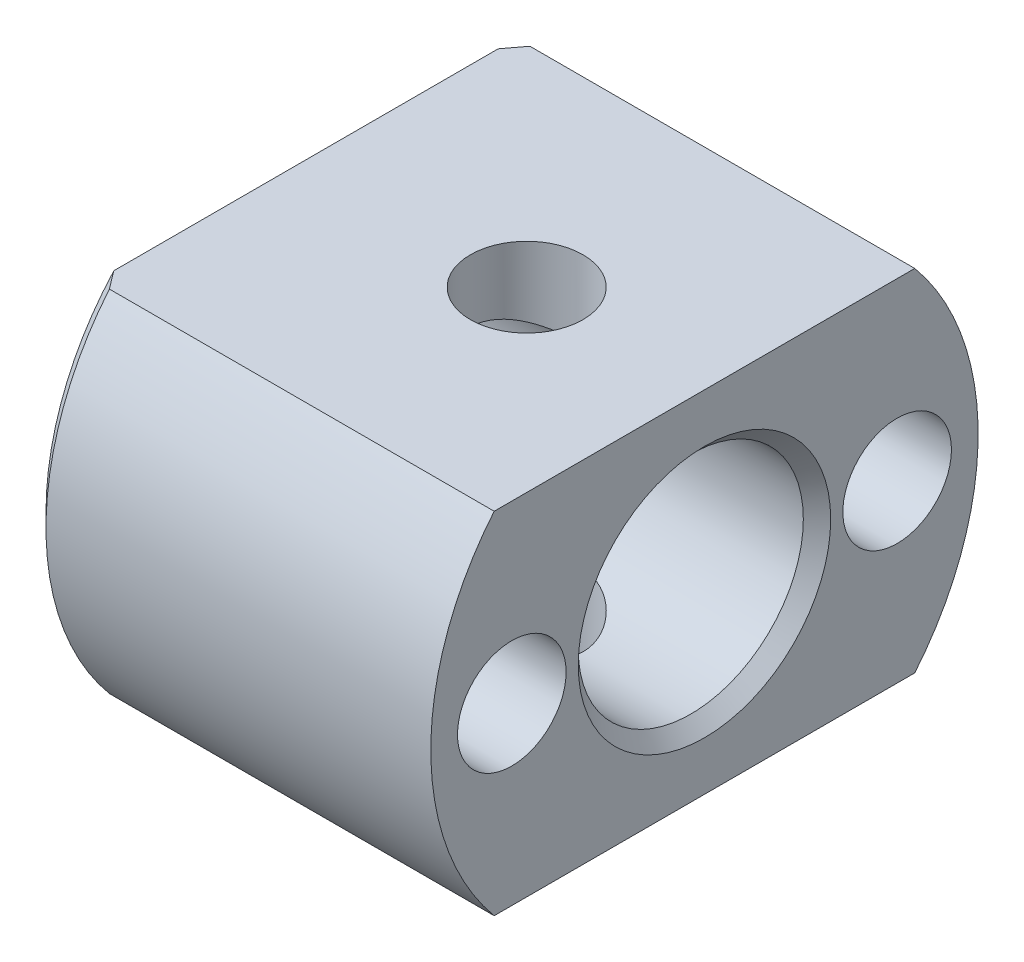
ISO-10303-21;
HEADER;
FILE_DESCRIPTION(('STEP AP214'),'2;1');
FILE_NAME('part.step','',(''),(''),'','','');
FILE_SCHEMA(('AUTOMOTIVE_DESIGN { 1 0 10303 214 1 1 1 1 }'));
ENDSEC;
DATA;
#1=APPLICATION_CONTEXT('core data for automotive mechanical design processes');
#2=APPLICATION_PROTOCOL_DEFINITION('international standard','automotive_design',2000,#1);
#3=PRODUCT_CONTEXT('',#1,'mechanical');
#4=PRODUCT('Part','Part','',(#3));
#5=PRODUCT_RELATED_PRODUCT_CATEGORY('part','',(#4));
#6=PRODUCT_DEFINITION_FORMATION('','',#4);
#7=PRODUCT_DEFINITION_CONTEXT('part definition',#1,'design');
#8=PRODUCT_DEFINITION('design','',#6,#7);
#9=PRODUCT_DEFINITION_SHAPE('','',#8);
#10=(LENGTH_UNIT() NAMED_UNIT(*) SI_UNIT(.MILLI.,.METRE.));
#11=(NAMED_UNIT(*) PLANE_ANGLE_UNIT() SI_UNIT($,.RADIAN.));
#12=(NAMED_UNIT(*) SI_UNIT($,.STERADIAN.) SOLID_ANGLE_UNIT());
#13=UNCERTAINTY_MEASURE_WITH_UNIT(LENGTH_MEASURE(1.E-05),#10,'distance_accuracy_value','');
#14=(GEOMETRIC_REPRESENTATION_CONTEXT(3) GLOBAL_UNCERTAINTY_ASSIGNED_CONTEXT((#13)) GLOBAL_UNIT_ASSIGNED_CONTEXT((#10,
#11,#12)) REPRESENTATION_CONTEXT('',''));
#15=CARTESIAN_POINT('',(0.,0.,0.));
#16=DIRECTION('',(0.,0.,1.));
#17=DIRECTION('',(1.,0.,0.));
#18=AXIS2_PLACEMENT_3D('',#15,#16,#17);
#19=CARTESIAN_POINT('',(2.032,0.,0.));
#20=DIRECTION('',(-1.,0.,0.));
#21=DIRECTION('',(0.,0.,1.));
#22=AXIS2_PLACEMENT_3D('',#19,#20,#21);
#23=CYLINDRICAL_SURFACE('',#22,7.9375);
#24=DIRECTION('',(-1.,0.,0.));
#25=VECTOR('',#24,1.);
#26=CARTESIAN_POINT('',(2.032,-5.08,6.09897583615479));
#27=LINE('',#26,#25);
#28=CARTESIAN_POINT('',(2.032,-5.08,6.09897583615479));
#29=VERTEX_POINT('',#28);
#30=CARTESIAN_POINT('',(-9.128125,-5.08,6.09897583615479));
#31=VERTEX_POINT('',#30);
#32=EDGE_CURVE('E66',#29,#31,#27,.T.);
#33=ORIENTED_EDGE('',*,*,#32,.F.);
#34=CARTESIAN_POINT('',(2.032,0.,0.));
#35=DIRECTION('',(1.,0.,0.));
#36=DIRECTION('',(0.,0.,-1.));
#37=AXIS2_PLACEMENT_3D('',#34,#35,#36);
#38=CIRCLE('',#37,7.9375);
#39=CARTESIAN_POINT('',(2.032,5.08,6.09897583615479));
#40=VERTEX_POINT('',#39);
#41=EDGE_CURVE('E117',#40,#29,#38,.T.);
#42=ORIENTED_EDGE('',*,*,#41,.F.);
#43=DIRECTION('',(-1.,0.,0.));
#44=VECTOR('',#43,1.);
#45=CARTESIAN_POINT('',(2.032,5.08,6.09897583615479));
#46=LINE('',#45,#44);
#47=CARTESIAN_POINT('',(-9.128125,5.08,6.09897583615479));
#48=VERTEX_POINT('',#47);
#49=EDGE_CURVE('E105',#40,#48,#46,.T.);
#50=ORIENTED_EDGE('',*,*,#49,.T.);
#51=CARTESIAN_POINT('',(-9.128125,0.,0.));
#52=DIRECTION('',(1.,0.,0.));
#53=DIRECTION('',(0.,0.,-1.));
#54=AXIS2_PLACEMENT_3D('',#51,#52,#53);
#55=CIRCLE('',#54,7.9375);
#56=EDGE_CURVE('E112',#48,#31,#55,.T.);
#57=ORIENTED_EDGE('',*,*,#56,.T.);
#58=EDGE_LOOP('',(#33,#42,#50,#57));
#59=FACE_BOUND('',#58,.T.);
#60=ADVANCED_FACE('F44',(#59),#23,.T.);
#61=DIRECTION('',(-1.,0.,0.));
#62=VECTOR('',#61,1.);
#63=CARTESIAN_POINT('',(2.032,-5.08,-6.09897583615479));
#64=LINE('',#63,#62);
#65=CARTESIAN_POINT('',(-9.128125,-5.08,-6.09897583615479));
#66=VERTEX_POINT('',#65);
#67=CARTESIAN_POINT('',(2.032,-5.08,-6.09897583615479));
#68=VERTEX_POINT('',#67);
#69=EDGE_CURVE('E251',#66,#68,#64,.F.);
#70=ORIENTED_EDGE('',*,*,#69,.F.);
#71=CARTESIAN_POINT('',(-9.128125,5.08,-6.09897583615479));
#72=VERTEX_POINT('',#71);
#73=EDGE_CURVE('E121',#66,#72,#55,.T.);
#74=ORIENTED_EDGE('',*,*,#73,.T.);
#75=DIRECTION('',(-1.,0.,0.));
#76=VECTOR('',#75,1.);
#77=CARTESIAN_POINT('',(2.032,5.08,-6.09897583615479));
#78=LINE('',#77,#76);
#79=CARTESIAN_POINT('',(2.032,5.08,-6.09897583615479));
#80=VERTEX_POINT('',#79);
#81=EDGE_CURVE('E247',#72,#80,#78,.F.);
#82=ORIENTED_EDGE('',*,*,#81,.T.);
#83=EDGE_CURVE('E219',#68,#80,#38,.T.);
#84=ORIENTED_EDGE('',*,*,#83,.F.);
#85=EDGE_LOOP('',(#70,#74,#82,#84));
#86=FACE_BOUND('',#85,.T.);
#87=ADVANCED_FACE('F192',(#86),#23,.T.);
#88=CARTESIAN_POINT('',(2.032,0.,0.));
#89=DIRECTION('',(1.,0.,0.));
#90=DIRECTION('',(0.,0.,-1.));
#91=AXIS2_PLACEMENT_3D('',#88,#89,#90);
#92=PLANE('',#91);
#93=CARTESIAN_POINT('',(2.032,0.,0.));
#94=DIRECTION('',(1.,0.,0.));
#95=DIRECTION('',(0.,0.,-1.));
#96=AXIS2_PLACEMENT_3D('',#93,#94,#95);
#97=CIRCLE('',#96,3.660775);
#98=CARTESIAN_POINT('',(2.032,0.,-3.660775));
#99=VERTEX_POINT('',#98);
#100=EDGE_CURVE('E124',#99,#99,#97,.F.);
#101=ORIENTED_EDGE('',*,*,#100,.T.);
#102=EDGE_LOOP('',(#101));
#103=FACE_BOUND('',#102,.T.);
#104=CARTESIAN_POINT('',(2.032,0.,-5.588));
#105=DIRECTION('',(1.,0.,0.));
#106=DIRECTION('',(0.,0.,-1.));
#107=AXIS2_PLACEMENT_3D('',#104,#105,#106);
#108=CIRCLE('',#107,1.575);
#109=CARTESIAN_POINT('',(2.032,0.,-7.163));
#110=VERTEX_POINT('',#109);
#111=EDGE_CURVE('E209',#110,#110,#108,.F.);
#112=ORIENTED_EDGE('',*,*,#111,.T.);
#113=EDGE_LOOP('',(#112));
#114=FACE_BOUND('',#113,.T.);
#115=CARTESIAN_POINT('',(2.032,0.,5.588));
#116=DIRECTION('',(1.,0.,0.));
#117=DIRECTION('',(0.,0.,-1.));
#118=AXIS2_PLACEMENT_3D('',#115,#116,#117);
#119=CIRCLE('',#118,1.575);
#120=CARTESIAN_POINT('',(2.032,0.,4.013));
#121=VERTEX_POINT('',#120);
#122=EDGE_CURVE('E213',#121,#121,#119,.T.);
#123=ORIENTED_EDGE('',*,*,#122,.F.);
#124=EDGE_LOOP('',(#123));
#125=FACE_BOUND('',#124,.T.);
#126=ORIENTED_EDGE('',*,*,#41,.T.);
#127=DIRECTION('',(0.,0.,-1.));
#128=VECTOR('',#127,1.);
#129=CARTESIAN_POINT('',(2.032,-5.08,0.));
#130=LINE('',#129,#128);
#131=EDGE_CURVE('E216',#29,#68,#130,.T.);
#132=ORIENTED_EDGE('',*,*,#131,.T.);
#133=ORIENTED_EDGE('',*,*,#83,.T.);
#134=DIRECTION('',(0.,0.,-1.));
#135=VECTOR('',#134,1.);
#136=CARTESIAN_POINT('',(2.032,5.08,0.));
#137=LINE('',#136,#135);
#138=EDGE_CURVE('E118',#40,#80,#137,.T.);
#139=ORIENTED_EDGE('',*,*,#138,.F.);
#140=EDGE_LOOP('',(#126,#132,#133,#139));
#141=FACE_BOUND('',#140,.T.);
#142=ADVANCED_FACE('F196',(#103,#114,#125,#141),#92,.T.);
#143=CARTESIAN_POINT('',(-9.525,0.,0.));
#144=DIRECTION('',(1.,0.,0.));
#145=DIRECTION('',(0.,0.,-1.));
#146=AXIS2_PLACEMENT_3D('',#143,#144,#145);
#147=PLANE('',#146);
#148=CARTESIAN_POINT('',(-9.525,0.,5.588));
#149=DIRECTION('',(1.,0.,0.));
#150=DIRECTION('',(0.,0.,-1.));
#151=AXIS2_PLACEMENT_3D('',#148,#149,#150);
#152=CIRCLE('',#151,1.575);
#153=CARTESIAN_POINT('',(-9.525,0.,4.013));
#154=VERTEX_POINT('',#153);
#155=EDGE_CURVE('E373',#154,#154,#152,.T.);
#156=ORIENTED_EDGE('',*,*,#155,.T.);
#157=EDGE_LOOP('',(#156));
#158=FACE_BOUND('',#157,.T.);
#159=CARTESIAN_POINT('',(-9.525,0.,-5.588));
#160=DIRECTION('',(1.,0.,0.));
#161=DIRECTION('',(0.,0.,-1.));
#162=AXIS2_PLACEMENT_3D('',#159,#160,#161);
#163=CIRCLE('',#162,1.575);
#164=CARTESIAN_POINT('',(-9.525,0.,-7.163));
#165=VERTEX_POINT('',#164);
#166=EDGE_CURVE('E374',#165,#165,#163,.F.);
#167=ORIENTED_EDGE('',*,*,#166,.F.);
#168=EDGE_LOOP('',(#167));
#169=FACE_BOUND('',#168,.T.);
#170=CARTESIAN_POINT('',(-9.525,0.,0.));
#171=DIRECTION('',(1.,0.,0.));
#172=DIRECTION('',(0.,0.,-1.));
#173=AXIS2_PLACEMENT_3D('',#170,#171,#172);
#174=CIRCLE('',#173,3.660775);
#175=CARTESIAN_POINT('',(-9.525,0.,3.660775));
#176=VERTEX_POINT('',#175);
#177=EDGE_CURVE('E227',#176,#176,#174,.T.);
#178=ORIENTED_EDGE('',*,*,#177,.T.);
#179=EDGE_LOOP('',(#178));
#180=FACE_BOUND('',#179,.T.);
#181=DIRECTION('',(0.,0.,-1.));
#182=VECTOR('',#181,1.);
#183=CARTESIAN_POINT('',(-9.525,-5.08,0.));
#184=LINE('',#183,#182);
#185=CARTESIAN_POINT('',(-9.525,-5.08,5.57266770861364));
#186=VERTEX_POINT('',#185);
#187=CARTESIAN_POINT('',(-9.525,-5.08,-5.57266770861362));
#188=VERTEX_POINT('',#187);
#189=EDGE_CURVE('E241',#186,#188,#184,.T.);
#190=ORIENTED_EDGE('',*,*,#189,.F.);
#191=CARTESIAN_POINT('',(-9.525,0.,0.));
#192=DIRECTION('',(1.,0.,0.));
#193=DIRECTION('',(0.,0.,-1.));
#194=AXIS2_PLACEMENT_3D('',#191,#192,#193);
#195=CIRCLE('',#194,7.540625);
#196=CARTESIAN_POINT('',(-9.525,5.08,5.57266770861362));
#197=VERTEX_POINT('',#196);
#198=EDGE_CURVE('E222',#186,#197,#195,.F.);
#199=ORIENTED_EDGE('',*,*,#198,.T.);
#200=DIRECTION('',(0.,0.,-1.));
#201=VECTOR('',#200,1.);
#202=CARTESIAN_POINT('',(-9.525,5.08,0.));
#203=LINE('',#202,#201);
#204=CARTESIAN_POINT('',(-9.525,5.08,-5.57266770861362));
#205=VERTEX_POINT('',#204);
#206=EDGE_CURVE('E74',#197,#205,#203,.T.);
#207=ORIENTED_EDGE('',*,*,#206,.T.);
#208=EDGE_CURVE('E218',#205,#188,#195,.F.);
#209=ORIENTED_EDGE('',*,*,#208,.T.);
#210=EDGE_LOOP('',(#190,#199,#207,#209));
#211=FACE_BOUND('',#210,.T.);
#212=ADVANCED_FACE('F142',(#158,#169,#180,#211),#147,.F.);
#213=CARTESIAN_POINT('',(-3.1242,-7.9375,0.));
#214=DIRECTION('',(0.,1.,0.));
#215=DIRECTION('',(0.,0.,1.));
#216=AXIS2_PLACEMENT_3D('',#213,#214,#215);
#217=CYLINDRICAL_SURFACE('',#216,1.63195);
#218=CARTESIAN_POINT('',(-3.1242,-2.82662031541203,1.63195));
#219=CARTESIAN_POINT('',(-3.03916266241576,-2.82662772400109,1.63194406471948));
#220=CARTESIAN_POINT('',(-2.9540179504617,-2.83051611348359,1.62525895723807));
#221=CARTESIAN_POINT('',(-2.78634185541012,-2.84550663931427,1.59885929239313));
#222=CARTESIAN_POINT('',(-2.70381634644491,-2.8566239331897,1.57911735604919));
#223=CARTESIAN_POINT('',(-2.54412065637391,-2.8844609619268,1.52766831128066));
#224=CARTESIAN_POINT('',(-2.46692454489573,-2.90115086346174,1.49602480697214));
#225=CARTESIAN_POINT('',(-2.31895637355145,-2.93820626847871,1.42186503803797));
#226=CARTESIAN_POINT('',(-2.24818466149918,-2.95857197078864,1.37934818520968));
#227=CARTESIAN_POINT('',(-2.10862816628058,-3.00273690458291,1.28053656081937));
#228=CARTESIAN_POINT('',(-2.04048869353756,-3.02668078653958,1.22339464038483));
#229=CARTESIAN_POINT('',(-1.91425858053967,-3.07413657307132,1.09871655133643));
#230=CARTESIAN_POINT('',(-1.85617295272182,-3.09764825697908,1.03117522953041));
#231=CARTESIAN_POINT('',(-1.74786697768457,-3.14348619313365,0.882051943014368));
#232=CARTESIAN_POINT('',(-1.69844073354164,-3.16562570769136,0.799830427109071));
#233=CARTESIAN_POINT('',(-1.61441638454558,-3.20434616416626,0.62692505955906));
#234=CARTESIAN_POINT('',(-1.57980892173695,-3.22093061262307,0.536246592614562));
#235=CARTESIAN_POINT('',(-1.52896126798968,-3.24562968727533,0.355838446239998));
#236=CARTESIAN_POINT('',(-1.51158938046409,-3.25426301246485,0.266500356988225));
#237=CARTESIAN_POINT('',(-1.49197890262827,-3.26402376457589,0.085792637503453));
#238=CARTESIAN_POINT('',(-1.48973115568224,-3.26515573305111,-0.00557572990668942));
#239=CARTESIAN_POINT('',(-1.49999633458591,-3.26003198338551,-0.179241188233339));
#240=CARTESIAN_POINT('',(-1.51124265942986,-3.25441014371211,-0.261636180996565));
#241=CARTESIAN_POINT('',(-1.54590989321021,-3.23736849551645,-0.423187110082106));
#242=CARTESIAN_POINT('',(-1.56933171316475,-3.22594825313651,-0.502342803549232));
#243=CARTESIAN_POINT('',(-1.62783659373027,-3.19815825346288,-0.656548811571933));
#244=CARTESIAN_POINT('',(-1.66307650928116,-3.18172220353577,-0.731527174505596));
#245=CARTESIAN_POINT('',(-1.74400018207003,-3.14538201367974,-0.874687341229677));
#246=CARTESIAN_POINT('',(-1.78968767835627,-3.12547663273206,-0.942866699172228));
#247=CARTESIAN_POINT('',(-1.8951708689343,-3.08184609439822,-1.07737040590281));
#248=CARTESIAN_POINT('',(-1.95589193707663,-3.05793772660222,-1.14291019374417));
#249=CARTESIAN_POINT('',(-2.0872422015998,-3.01020261120647,-1.26329962710746));
#250=CARTESIAN_POINT('',(-2.15787894988266,-2.98637594013093,-1.31814104782857));
#251=CARTESIAN_POINT('',(-2.31254671762649,-2.9398625553513,-1.41898923086936));
#252=CARTESIAN_POINT('',(-2.39714346532332,-2.91734432008835,-1.46421379717843));
#253=CARTESIAN_POINT('',(-2.57413113277432,-2.87835916082122,-1.53944962646236));
#254=CARTESIAN_POINT('',(-2.66651380136301,-2.8618859273368,-1.56947676426726));
#255=CARTESIAN_POINT('',(-2.84875052168795,-2.83868948421609,-1.61102874538232));
#256=CARTESIAN_POINT('',(-2.93822480422312,-2.83129707761954,-1.6238312480437));
#257=CARTESIAN_POINT('',(-3.11832716928792,-2.82519788502179,-1.63442558102252));
#258=CARTESIAN_POINT('',(-3.20895439160204,-2.82648496364012,-1.63222801462026));
#259=CARTESIAN_POINT('',(-3.37821941242456,-2.83688945517407,-1.61405737093519));
#260=CARTESIAN_POINT('',(-3.45708426523558,-2.84513489831484,-1.59961750748391));
#261=CARTESIAN_POINT('',(-3.61112130880489,-2.86723858470711,-1.55964855170591));
#262=CARTESIAN_POINT('',(-3.68629229492593,-2.88109864554415,-1.53411586817481));
#263=CARTESIAN_POINT('',(-3.83476952146665,-2.91362187622896,-1.47144378222374));
#264=CARTESIAN_POINT('',(-3.90782814655415,-2.93247777190517,-1.43382158224334));
#265=CARTESIAN_POINT('',(-4.04701757768806,-2.97269679213537,-1.34845917412059));
#266=CARTESIAN_POINT('',(-4.1131447987315,-2.99406120212933,-1.30071376834996));
#267=CARTESIAN_POINT('',(-4.24531499966006,-3.04012699080817,-1.18942581501017));
#268=CARTESIAN_POINT('',(-4.31029661011369,-3.06490953378642,-1.12465062715441));
#269=CARTESIAN_POINT('',(-4.42880080179364,-3.11268734772172,-0.984725966265238));
#270=CARTESIAN_POINT('',(-4.48231951228773,-3.13568201329331,-0.909573002963794));
#271=CARTESIAN_POINT('',(-4.57757179206427,-3.17808165211557,-0.748306784927765));
#272=CARTESIAN_POINT('',(-4.6189570522643,-3.19737587026668,-0.661956614086075));
#273=CARTESIAN_POINT('',(-4.68620120220007,-3.22935741125831,-0.482277722976016));
#274=CARTESIAN_POINT('',(-4.71207372544724,-3.24205053422657,-0.388955211786963));
#275=CARTESIAN_POINT('',(-4.74532782830484,-3.25847389977424,-0.207224492579125));
#276=CARTESIAN_POINT('',(-4.75418819353602,-3.26291965349773,-0.119151025791754));
#277=CARTESIAN_POINT('',(-4.75752616705831,-3.26458754665695,0.0573238527730659));
#278=CARTESIAN_POINT('',(-4.75200881022903,-3.26181221481761,0.145725138926566));
#279=CARTESIAN_POINT('',(-4.72772729492988,-3.24976680445048,0.314212376561967));
#280=CARTESIAN_POINT('',(-4.70985998425394,-3.24093674453426,0.394462417052091));
#281=CARTESIAN_POINT('',(-4.66259520348752,-3.21807637254024,0.550694921666053));
#282=CARTESIAN_POINT('',(-4.63319607989349,-3.20404531472666,0.626676772003141));
#283=CARTESIAN_POINT('',(-4.56239338721774,-3.17130202684395,0.775867227821338));
#284=CARTESIAN_POINT('',(-4.52053016349097,-3.1524152483758,0.848818226629339));
#285=CARTESIAN_POINT('',(-4.42656475473457,-3.11193498880803,0.986961976708396));
#286=CARTESIAN_POINT('',(-4.37445786700068,-3.09034026618917,1.05215114249076));
#287=CARTESIAN_POINT('',(-4.2554724089719,-3.04405365459345,1.17975950908384));
#288=CARTESIAN_POINT('',(-4.1876398385616,-3.0192674149714,1.24125739128386));
#289=CARTESIAN_POINT('',(-4.04225229565227,-2.97117837143967,1.35233705186374));
#290=CARTESIAN_POINT('',(-3.96468881328498,-2.94787689321076,1.40190828807891));
#291=CARTESIAN_POINT('',(-3.79878832461221,-2.90486455877358,1.4890419006562));
#292=CARTESIAN_POINT('',(-3.71018831557446,-2.8852904437752,1.52617526839495));
#293=CARTESIAN_POINT('',(-3.5267491827377,-2.85372823820053,1.58442550997899));
#294=CARTESIAN_POINT('',(-3.43193209693894,-2.84171479852242,1.60559595143861));
#295=CARTESIAN_POINT('',(-3.30076824984373,-2.83191096422492,1.62275723848433));
#296=CARTESIAN_POINT('',(-3.26557926473737,-2.82993396129957,1.62619917949576));
#297=CARTESIAN_POINT('',(-3.19499973435061,-2.82728705072014,1.63079687243656));
#298=CARTESIAN_POINT('',(-3.15960917574507,-2.82661723050792,1.63195247142487));
#299=CARTESIAN_POINT('',(-3.1242,-2.82662031541203,1.63195));
#300=B_SPLINE_CURVE_WITH_KNOTS('',3,(#218,#219,#220,#221,#222,#223,#224,#225,#226,#227,#228,
#229,#230,#231,#232,#233,#234,#235,#236,#237,#238,#239,#240,#241,#242,#243,#244,#245,#246,#247,
#248,#249,#250,#251,#252,#253,#254,#255,#256,#257,#258,#259,#260,#261,#262,#263,#264,#265,#266,
#267,#268,#269,#270,#271,#272,#273,#274,#275,#276,#277,#278,#279,#280,#281,#282,#283,#284,#285,
#286,#287,#288,#289,#290,#291,#292,#293,#294,#295,#296,#297,#298,#299),.UNSPECIFIED.,.T.,.F.,(4,
2,2,2,2,2,2,2,2,2,2,2,2,2,2,2,2,2,2,2,2,2,2,2,2,2,2,2,2,2,2,2,2,2,2,2,2,2,2,2,4),(0.,
0.254963012468446,0.51046236144544,0.764615242109826,1.01878187429021,1.29391165088149,
1.56917820331139,1.8629997223905,2.15663542063722,2.42937764293422,2.70195472354433,
2.95082830289892,3.19972050662861,3.45205624204495,3.70448242674676,3.98076980098073,
4.25726875234927,4.55132645260373,4.84507635074792,5.11554785559531,5.38582818878765,
5.62654228638838,5.86733437123033,6.11927879369915,6.37135288836806,6.65520215186382,
6.93914711351177,7.23058590856889,7.52176819308925,7.78623369662123,8.05060660043422,
8.29755879169032,8.5445464054493,8.80209777136642,9.05976765232869,9.34308089187217,
9.62664364426149,9.91916751893551,10.2107053330385,10.3168637161567,10.4230292003247),.UNSPECIFIED.);
#301=CARTESIAN_POINT('',(-3.1242,-2.82662031541203,1.63195));
#302=VERTEX_POINT('',#301);
#303=EDGE_CURVE('E148',#302,#302,#300,.T.);
#304=ORIENTED_EDGE('',*,*,#303,.T.);
#305=EDGE_LOOP('',(#304));
#306=FACE_BOUND('',#305,.T.);
#307=CARTESIAN_POINT('',(-3.1242,-5.08,0.));
#308=DIRECTION('',(0.,-1.,0.));
#309=DIRECTION('',(0.,0.,-1.));
#310=AXIS2_PLACEMENT_3D('',#307,#308,#309);
#311=CIRCLE('',#310,1.63195);
#312=CARTESIAN_POINT('',(-3.1242,-5.08,-1.63195));
#313=VERTEX_POINT('',#312);
#314=EDGE_CURVE('E161',#313,#313,#311,.F.);
#315=ORIENTED_EDGE('',*,*,#314,.F.);
#316=EDGE_LOOP('',(#315));
#317=FACE_BOUND('',#316,.T.);
#318=ADVANCED_FACE('F138',(#306,#317),#217,.F.);
#319=CARTESIAN_POINT('',(-9.128125,0.,0.));
#320=DIRECTION('',(1.,0.,0.));
#321=DIRECTION('',(0.,0.,-1.));
#322=AXIS2_PLACEMENT_3D('',#319,#320,#321);
#323=CONICAL_SURFACE('',#322,7.9375,0.785398163397453);
#324=ORIENTED_EDGE('',*,*,#73,.F.);
#325=CARTESIAN_POINT('',(-9.127425,-5.08,-6.09988682190088));
#326=CARTESIAN_POINT('',(-9.24204980086968,-5.08,-5.95068288505701));
#327=CARTESIAN_POINT('',(-9.35563029055151,-5.08,-5.80066345163349));
#328=CARTESIAN_POINT('',(-9.58021873878119,-5.08,-5.49865558705955));
#329=CARTESIAN_POINT('',(-9.69122605360265,-5.08,-5.34666667772324));
#330=CARTESIAN_POINT('',(-9.91102337321846,-5.08,-5.03920151181867));
#331=CARTESIAN_POINT('',(-10.0197877729485,-5.08,-4.88370688885874));
#332=CARTESIAN_POINT('',(-10.2334328700727,-5.08,-4.57008065030622));
#333=CARTESIAN_POINT('',(-10.3383138418424,-5.08,-4.41194922216099));
#334=CARTESIAN_POINT('',(-10.5501156949655,-5.08,-4.0819757631368));
#335=CARTESIAN_POINT('',(-10.6567078608569,-5.08,-3.90992161807157));
#336=CARTESIAN_POINT('',(-10.8630244707936,-5.08,-3.56167646421194));
#337=CARTESIAN_POINT('',(-10.9627477022794,-5.08,-3.3854847323412));
#338=CARTESIAN_POINT('',(-11.1530847712256,-5.08,-3.02892549344396));
#339=CARTESIAN_POINT('',(-11.2437264778794,-5.08,-2.84857299073836));
#340=CARTESIAN_POINT('',(-11.4137359526367,-5.08,-2.48267463125855));
#341=CARTESIAN_POINT('',(-11.4931092723413,-5.08,-2.2971313861247));
#342=CARTESIAN_POINT('',(-11.6344309351293,-5.08,-1.92851490968909));
#343=CARTESIAN_POINT('',(-11.6969786842357,-5.08,-1.74567460858899));
#344=CARTESIAN_POINT('',(-11.8057728362921,-5.08,-1.37512336073294));
#345=CARTESIAN_POINT('',(-11.8520199390843,-5.08,-1.18741262345296));
#346=CARTESIAN_POINT('',(-11.9242991694479,-5.08,-0.812340539993367));
#347=CARTESIAN_POINT('',(-11.9507533231571,-5.08,-0.625062220165761));
#348=CARTESIAN_POINT('',(-11.9829919439029,-5.08,-0.248724249309546));
#349=CARTESIAN_POINT('',(-11.9887801689555,-5.08,-0.0596649284188974));
#350=CARTESIAN_POINT('',(-11.9791707513326,-5.08,0.31860265527366));
#351=CARTESIAN_POINT('',(-11.9636945273523,-5.08,0.507808874199122));
#352=CARTESIAN_POINT('',(-11.9127363904579,-5.08,0.883490676332864));
#353=CARTESIAN_POINT('',(-11.8772493053544,-5.08,1.06996554078069));
#354=CARTESIAN_POINT('',(-11.7878898945343,-5.08,1.44278064829043));
#355=CARTESIAN_POINT('',(-11.7336246472869,-5.08,1.62902486622444));
#356=CARTESIAN_POINT('',(-11.6101608257655,-5.08,1.99641178889479));
#357=CARTESIAN_POINT('',(-11.5409619938312,-5.08,2.17755440554839));
#358=CARTESIAN_POINT('',(-11.3920685004807,-5.08,2.53142943959996));
#359=CARTESIAN_POINT('',(-11.3125941487772,-5.08,2.70425576387929));
#360=CARTESIAN_POINT('',(-11.1445467754902,-5.08,3.04545924807842));
#361=CARTESIAN_POINT('',(-11.0559706308559,-5.08,3.21383485576485));
#362=CARTESIAN_POINT('',(-10.8714313700247,-5.08,3.54695696683724));
#363=CARTESIAN_POINT('',(-10.7754520111165,-5.08,3.71169440809592));
#364=CARTESIAN_POINT('',(-10.5777708310201,-5.08,4.03765253529767));
#365=CARTESIAN_POINT('',(-10.476069727764,-5.08,4.19887365894132));
#366=CARTESIAN_POINT('',(-10.2744209360305,-5.08,4.50854710136588));
#367=CARTESIAN_POINT('',(-10.1747458127731,-5.08,4.65717770409077));
#368=CARTESIAN_POINT('',(-9.97205611621789,-5.08,4.95215046453449));
#369=CARTESIAN_POINT('',(-9.86904136058242,-5.08,5.09849249665288));
#370=CARTESIAN_POINT('',(-9.66087505647831,-5.08,5.38832506358979));
#371=CARTESIAN_POINT('',(-9.55573986870922,-5.08,5.53182738387818));
#372=CARTESIAN_POINT('',(-9.34319020662555,-5.08,5.81709196274639));
#373=CARTESIAN_POINT('',(-9.23577618241421,-5.08,5.95885455637512));
#374=CARTESIAN_POINT('',(-9.127425,-5.08,6.09988682190088));
#375=B_SPLINE_CURVE_WITH_KNOTS('',3,(#325,#326,#327,#328,#329,#330,#331,#332,#333,#334,#335,
#336,#337,#338,#339,#340,#341,#342,#343,#344,#345,#346,#347,#348,#349,#350,#351,#352,#353,#354,
#355,#356,#357,#358,#359,#360,#361,#362,#363,#364,#365,#366,#367,#368,#369,#370,#371,#372,#373,
#374),.UNSPECIFIED.,.F.,.F.,(4,2,2,2,2,2,2,2,2,2,2,2,2,2,2,2,2,2,2,2,2,2,2,2,4),(0.,
0.564462801719474,1.12906532245986,1.69829184793939,2.26747807884511,2.87454192699576,
3.48171266572311,4.08695906548077,4.69190623566581,5.27101760997042,5.85010411802446,
6.41646090638696,6.98271469979816,7.551066682499,8.1195656340076,8.70076167097238,
9.28196773655252,9.85231237608731,10.4228533726503,10.9946838381702,11.56644271297,
12.1032656589534,12.6401179639768,13.1737760293474,13.7073296531562),.UNSPECIFIED.);
#376=EDGE_CURVE('E11',#66,#188,#375,.T.);
#377=ORIENTED_EDGE('',*,*,#376,.T.);
#378=ORIENTED_EDGE('',*,*,#208,.F.);
#379=CARTESIAN_POINT('',(-9.127425,5.08,-6.09988682190088));
#380=CARTESIAN_POINT('',(-9.24204980086968,5.08,-5.95068288505701));
#381=CARTESIAN_POINT('',(-9.35563029055151,5.08,-5.80066345163349));
#382=CARTESIAN_POINT('',(-9.58021873878119,5.08,-5.49865558705955));
#383=CARTESIAN_POINT('',(-9.69122605360265,5.08,-5.34666667772324));
#384=CARTESIAN_POINT('',(-9.91102337321846,5.08,-5.03920151181867));
#385=CARTESIAN_POINT('',(-10.0197877729485,5.08,-4.88370688885874));
#386=CARTESIAN_POINT('',(-10.2334328700727,5.08,-4.57008065030622));
#387=CARTESIAN_POINT('',(-10.3383138418424,5.08,-4.41194922216099));
#388=CARTESIAN_POINT('',(-10.5501156949655,5.08,-4.0819757631368));
#389=CARTESIAN_POINT('',(-10.6567078608569,5.08,-3.90992161807157));
#390=CARTESIAN_POINT('',(-10.8630244707936,5.08,-3.56167646421194));
#391=CARTESIAN_POINT('',(-10.9627477022794,5.08,-3.3854847323412));
#392=CARTESIAN_POINT('',(-11.1530847712256,5.08,-3.02892549344396));
#393=CARTESIAN_POINT('',(-11.2437264778794,5.08,-2.84857299073836));
#394=CARTESIAN_POINT('',(-11.4137359526367,5.08,-2.48267463125855));
#395=CARTESIAN_POINT('',(-11.4931092723413,5.08,-2.2971313861247));
#396=CARTESIAN_POINT('',(-11.6344309351293,5.08,-1.92851490968909));
#397=CARTESIAN_POINT('',(-11.6969786842357,5.08,-1.74567460858899));
#398=CARTESIAN_POINT('',(-11.8057728362921,5.08,-1.37512336073294));
#399=CARTESIAN_POINT('',(-11.8520199390843,5.08,-1.18741262345296));
#400=CARTESIAN_POINT('',(-11.9242991694479,5.08,-0.812340539993367));
#401=CARTESIAN_POINT('',(-11.9507533231571,5.08,-0.625062220165761));
#402=CARTESIAN_POINT('',(-11.9829919439029,5.08,-0.248724249309546));
#403=CARTESIAN_POINT('',(-11.9887801689555,5.08,-0.0596649284188974));
#404=CARTESIAN_POINT('',(-11.9791707513326,5.08,0.31860265527366));
#405=CARTESIAN_POINT('',(-11.9636945273523,5.08,0.507808874199122));
#406=CARTESIAN_POINT('',(-11.9127363904579,5.08,0.883490676332864));
#407=CARTESIAN_POINT('',(-11.8772493053544,5.08,1.06996554078069));
#408=CARTESIAN_POINT('',(-11.7878898945343,5.08,1.44278064829043));
#409=CARTESIAN_POINT('',(-11.7336246472869,5.08,1.62902486622444));
#410=CARTESIAN_POINT('',(-11.6101608257655,5.08,1.99641178889479));
#411=CARTESIAN_POINT('',(-11.5409619938312,5.08,2.17755440554839));
#412=CARTESIAN_POINT('',(-11.3920685004807,5.08,2.53142943959996));
#413=CARTESIAN_POINT('',(-11.3125941487772,5.08,2.70425576387929));
#414=CARTESIAN_POINT('',(-11.1445467754902,5.08,3.04545924807842));
#415=CARTESIAN_POINT('',(-11.0559706308559,5.08,3.21383485576485));
#416=CARTESIAN_POINT('',(-10.8714313700247,5.08,3.54695696683724));
#417=CARTESIAN_POINT('',(-10.7754520111165,5.08,3.71169440809592));
#418=CARTESIAN_POINT('',(-10.5777708310201,5.08,4.03765253529767));
#419=CARTESIAN_POINT('',(-10.476069727764,5.08,4.19887365894132));
#420=CARTESIAN_POINT('',(-10.2744209360305,5.08,4.50854710136588));
#421=CARTESIAN_POINT('',(-10.1747458127731,5.08,4.65717770409077));
#422=CARTESIAN_POINT('',(-9.97205611621789,5.08,4.95215046453449));
#423=CARTESIAN_POINT('',(-9.86904136058242,5.08,5.09849249665288));
#424=CARTESIAN_POINT('',(-9.66087505647831,5.08,5.38832506358979));
#425=CARTESIAN_POINT('',(-9.55573986870922,5.08,5.53182738387818));
#426=CARTESIAN_POINT('',(-9.34319020662555,5.08,5.81709196274639));
#427=CARTESIAN_POINT('',(-9.23577618241421,5.08,5.95885455637512));
#428=CARTESIAN_POINT('',(-9.127425,5.08,6.09988682190088));
#429=B_SPLINE_CURVE_WITH_KNOTS('',3,(#379,#380,#381,#382,#383,#384,#385,#386,#387,#388,#389,
#390,#391,#392,#393,#394,#395,#396,#397,#398,#399,#400,#401,#402,#403,#404,#405,#406,#407,#408,
#409,#410,#411,#412,#413,#414,#415,#416,#417,#418,#419,#420,#421,#422,#423,#424,#425,#426,#427,
#428),.UNSPECIFIED.,.F.,.F.,(4,2,2,2,2,2,2,2,2,2,2,2,2,2,2,2,2,2,2,2,2,2,2,2,4),(0.,
0.564462801719474,1.12906532245986,1.69829184793939,2.26747807884511,2.87454192699576,
3.48171266572311,4.08695906548077,4.69190623566581,5.27101760997042,5.85010411802446,
6.41646090638696,6.98271469979816,7.551066682499,8.1195656340076,8.70076167097238,
9.28196773655252,9.85231237608731,10.4228533726503,10.9946838381702,11.56644271297,
12.1032656589534,12.6401179639768,13.1737760293474,13.7073296531562),.UNSPECIFIED.);
#430=EDGE_CURVE('E111',#72,#205,#429,.T.);
#431=ORIENTED_EDGE('',*,*,#430,.F.);
#432=EDGE_LOOP('',(#324,#377,#378,#431));
#433=FACE_BOUND('',#432,.T.);
#434=ADVANCED_FACE('F47',(#433),#323,.T.);
#435=ORIENTED_EDGE('',*,*,#198,.F.);
#436=EDGE_CURVE('E50',#186,#31,#375,.T.);
#437=ORIENTED_EDGE('',*,*,#436,.T.);
#438=ORIENTED_EDGE('',*,*,#56,.F.);
#439=EDGE_CURVE('E101',#197,#48,#429,.T.);
#440=ORIENTED_EDGE('',*,*,#439,.F.);
#441=EDGE_LOOP('',(#435,#437,#438,#440));
#442=FACE_BOUND('',#441,.T.);
#443=ADVANCED_FACE('F120',(#442),#323,.T.);
#444=CARTESIAN_POINT('',(2.032,0.,5.588));
#445=DIRECTION('',(-1.,0.,0.));
#446=DIRECTION('',(0.,0.,1.));
#447=AXIS2_PLACEMENT_3D('',#444,#445,#446);
#448=CYLINDRICAL_SURFACE('',#447,1.575);
#449=ORIENTED_EDGE('',*,*,#122,.T.);
#450=EDGE_LOOP('',(#449));
#451=FACE_BOUND('',#450,.T.);
#452=ORIENTED_EDGE('',*,*,#155,.F.);
#453=EDGE_LOOP('',(#452));
#454=FACE_BOUND('',#453,.T.);
#455=ADVANCED_FACE('F169',(#451,#454),#448,.F.);
#456=CARTESIAN_POINT('',(2.032,0.,0.));
#457=DIRECTION('',(-1.,0.,0.));
#458=DIRECTION('',(0.,0.,1.));
#459=AXIS2_PLACEMENT_3D('',#456,#457,#458);
#460=CYLINDRICAL_SURFACE('',#459,3.2639);
#461=CARTESIAN_POINT('',(-9.128125,0.,0.));
#462=DIRECTION('',(1.,0.,0.));
#463=DIRECTION('',(0.,0.,-1.));
#464=AXIS2_PLACEMENT_3D('',#461,#462,#463);
#465=CIRCLE('',#464,3.2639);
#466=CARTESIAN_POINT('',(-9.128125,0.,3.2639));
#467=VERTEX_POINT('',#466);
#468=EDGE_CURVE('E232',#467,#467,#465,.F.);
#469=ORIENTED_EDGE('',*,*,#468,.T.);
#470=EDGE_LOOP('',(#469));
#471=FACE_BOUND('',#470,.T.);
#472=CARTESIAN_POINT('',(1.635125,0.,0.));
#473=DIRECTION('',(1.,0.,0.));
#474=DIRECTION('',(0.,0.,-1.));
#475=AXIS2_PLACEMENT_3D('',#472,#473,#474);
#476=CIRCLE('',#475,3.2639);
#477=CARTESIAN_POINT('',(1.635125,0.,-3.2639));
#478=VERTEX_POINT('',#477);
#479=EDGE_CURVE('E230',#478,#478,#476,.T.);
#480=ORIENTED_EDGE('',*,*,#479,.T.);
#481=EDGE_LOOP('',(#480));
#482=FACE_BOUND('',#481,.T.);
#483=ORIENTED_EDGE('',*,*,#303,.F.);
#484=EDGE_LOOP('',(#483));
#485=FACE_BOUND('',#484,.T.);
#486=CARTESIAN_POINT('',(-3.1242,2.82662031541203,1.63195));
#487=CARTESIAN_POINT('',(-3.20923733758424,2.82662772400109,1.63194406471948));
#488=CARTESIAN_POINT('',(-3.2943820495383,2.83051611348359,1.62525895723807));
#489=CARTESIAN_POINT('',(-3.46205814458988,2.84550663931427,1.59885929239313));
#490=CARTESIAN_POINT('',(-3.54458365355509,2.8566239331897,1.57911735604919));
#491=CARTESIAN_POINT('',(-3.7042793436261,2.8844609619268,1.52766831128066));
#492=CARTESIAN_POINT('',(-3.78147545510427,2.90115086346174,1.49602480697214));
#493=CARTESIAN_POINT('',(-3.92944362644855,2.93820626847871,1.42186503803797));
#494=CARTESIAN_POINT('',(-4.00021533850082,2.95857197078864,1.37934818520968));
#495=CARTESIAN_POINT('',(-4.13977183371942,3.00273690458291,1.28053656081937));
#496=CARTESIAN_POINT('',(-4.20791130646244,3.02668078653958,1.22339464038483));
#497=CARTESIAN_POINT('',(-4.33414141946033,3.07413657307132,1.09871655133643));
#498=CARTESIAN_POINT('',(-4.39222704727818,3.09764825697908,1.03117522953041));
#499=CARTESIAN_POINT('',(-4.50053302231543,3.14348619313365,0.882051943014367));
#500=CARTESIAN_POINT('',(-4.54995926645836,3.16562570769137,0.799830427109071));
#501=CARTESIAN_POINT('',(-4.63398361545442,3.20434616416626,0.62692505955906));
#502=CARTESIAN_POINT('',(-4.66859107826306,3.22093061262307,0.536246592614562));
#503=CARTESIAN_POINT('',(-4.71943873201033,3.24562968727533,0.355838446239997));
#504=CARTESIAN_POINT('',(-4.73681061953591,3.25426301246485,0.266500356988224));
#505=CARTESIAN_POINT('',(-4.75642109737173,3.26402376457589,0.085792637503452));
#506=CARTESIAN_POINT('',(-4.75866884431776,3.26515573305111,-0.00557572990669025));
#507=CARTESIAN_POINT('',(-4.74840366541409,3.26003198338551,-0.17924118823334));
#508=CARTESIAN_POINT('',(-4.73715734057014,3.25441014371211,-0.261636180996566));
#509=CARTESIAN_POINT('',(-4.70249010678979,3.23736849551645,-0.423187110082106));
#510=CARTESIAN_POINT('',(-4.67906828683525,3.22594825313651,-0.502342803549232));
#511=CARTESIAN_POINT('',(-4.62056340626973,3.19815825346288,-0.656548811571934));
#512=CARTESIAN_POINT('',(-4.58532349071885,3.18172220353577,-0.731527174505596));
#513=CARTESIAN_POINT('',(-4.50439981792997,3.14538201367974,-0.874687341229677));
#514=CARTESIAN_POINT('',(-4.45871232164373,3.12547663273206,-0.942866699172229));
#515=CARTESIAN_POINT('',(-4.3532291310657,3.08184609439822,-1.07737040590281));
#516=CARTESIAN_POINT('',(-4.29250806292337,3.05793772660222,-1.14291019374417));
#517=CARTESIAN_POINT('',(-4.1611577984002,3.01020261120647,-1.26329962710746));
#518=CARTESIAN_POINT('',(-4.09052105011734,2.98637594013093,-1.31814104782857));
#519=CARTESIAN_POINT('',(-3.93585328237351,2.9398625553513,-1.41898923086936));
#520=CARTESIAN_POINT('',(-3.85125653467668,2.91734432008835,-1.46421379717843));
#521=CARTESIAN_POINT('',(-3.67426886722568,2.87835916082122,-1.53944962646236));
#522=CARTESIAN_POINT('',(-3.58188619863699,2.8618859273368,-1.56947676426726));
#523=CARTESIAN_POINT('',(-3.39964947831205,2.83868948421609,-1.61102874538232));
#524=CARTESIAN_POINT('',(-3.31017519577688,2.83129707761954,-1.6238312480437));
#525=CARTESIAN_POINT('',(-3.13007283071208,2.82519788502179,-1.63442558102252));
#526=CARTESIAN_POINT('',(-3.03944560839796,2.82648496364012,-1.63222801462026));
#527=CARTESIAN_POINT('',(-2.87018058757544,2.83688945517407,-1.61405737093519));
#528=CARTESIAN_POINT('',(-2.79131573476442,2.84513489831484,-1.59961750748391));
#529=CARTESIAN_POINT('',(-2.63727869119511,2.86723858470711,-1.55964855170591));
#530=CARTESIAN_POINT('',(-2.56210770507407,2.88109864554415,-1.53411586817481));
#531=CARTESIAN_POINT('',(-2.41363047853335,2.91362187622896,-1.47144378222374));
#532=CARTESIAN_POINT('',(-2.34057185344585,2.93247777190517,-1.43382158224334));
#533=CARTESIAN_POINT('',(-2.20138242231194,2.97269679213537,-1.34845917412059));
#534=CARTESIAN_POINT('',(-2.1352552012685,2.99406120212933,-1.30071376834996));
#535=CARTESIAN_POINT('',(-2.00308500033995,3.04012699080817,-1.18942581501017));
#536=CARTESIAN_POINT('',(-1.93810338988632,3.06490953378642,-1.12465062715441));
#537=CARTESIAN_POINT('',(-1.81959919820636,3.11268734772172,-0.984725966265238));
#538=CARTESIAN_POINT('',(-1.76608048771227,3.13568201329331,-0.909573002963794));
#539=CARTESIAN_POINT('',(-1.67082820793573,3.17808165211557,-0.748306784927765));
#540=CARTESIAN_POINT('',(-1.62944294773571,3.19737587026668,-0.661956614086075));
#541=CARTESIAN_POINT('',(-1.56219879779993,3.22935741125831,-0.482277722976015));
#542=CARTESIAN_POINT('',(-1.53632627455276,3.24205053422657,-0.388955211786963));
#543=CARTESIAN_POINT('',(-1.50307217169516,3.25847389977424,-0.207224492579125));
#544=CARTESIAN_POINT('',(-1.49421180646398,3.26291965349773,-0.119151025791754));
#545=CARTESIAN_POINT('',(-1.49087383294169,3.26458754665695,0.0573238527730662));
#546=CARTESIAN_POINT('',(-1.49639118977097,3.26181221481761,0.145725138926566));
#547=CARTESIAN_POINT('',(-1.52067270507012,3.24976680445048,0.314212376561967));
#548=CARTESIAN_POINT('',(-1.53854001574606,3.24093674453426,0.394462417052091));
#549=CARTESIAN_POINT('',(-1.58580479651248,3.21807637254024,0.550694921666053));
#550=CARTESIAN_POINT('',(-1.61520392010651,3.20404531472666,0.626676772003142));
#551=CARTESIAN_POINT('',(-1.68600661278226,3.17130202684395,0.775867227821338));
#552=CARTESIAN_POINT('',(-1.72786983650903,3.1524152483758,0.848818226629339));
#553=CARTESIAN_POINT('',(-1.82183524526543,3.11193498880803,0.986961976708396));
#554=CARTESIAN_POINT('',(-1.87394213299932,3.09034026618917,1.05215114249076));
#555=CARTESIAN_POINT('',(-1.9929275910281,3.04405365459345,1.17975950908384));
#556=CARTESIAN_POINT('',(-2.0607601614384,3.0192674149714,1.24125739128386));
#557=CARTESIAN_POINT('',(-2.20614770434773,2.97117837143967,1.35233705186374));
#558=CARTESIAN_POINT('',(-2.28371118671502,2.94787689321076,1.40190828807891));
#559=CARTESIAN_POINT('',(-2.44961167538779,2.90486455877358,1.4890419006562));
#560=CARTESIAN_POINT('',(-2.53821168442554,2.8852904437752,1.52617526839495));
#561=CARTESIAN_POINT('',(-2.7216508172623,2.85372823820053,1.58442550997899));
#562=CARTESIAN_POINT('',(-2.81646790306106,2.84171479852242,1.60559595143861));
#563=CARTESIAN_POINT('',(-2.94763175015628,2.83191096422492,1.62275723848433));
#564=CARTESIAN_POINT('',(-2.98282073526263,2.82993396129957,1.62619917949576));
#565=CARTESIAN_POINT('',(-3.05340026564939,2.82728705072014,1.63079687243656));
#566=CARTESIAN_POINT('',(-3.08879082425493,2.82661723050792,1.63195247142487));
#567=CARTESIAN_POINT('',(-3.1242,2.82662031541203,1.63195));
#568=B_SPLINE_CURVE_WITH_KNOTS('',3,(#486,#487,#488,#489,#490,#491,#492,#493,#494,#495,#496,
#497,#498,#499,#500,#501,#502,#503,#504,#505,#506,#507,#508,#509,#510,#511,#512,#513,#514,#515,
#516,#517,#518,#519,#520,#521,#522,#523,#524,#525,#526,#527,#528,#529,#530,#531,#532,#533,#534,
#535,#536,#537,#538,#539,#540,#541,#542,#543,#544,#545,#546,#547,#548,#549,#550,#551,#552,#553,
#554,#555,#556,#557,#558,#559,#560,#561,#562,#563,#564,#565,#566,#567),.UNSPECIFIED.,.T.,.F.,(4,
2,2,2,2,2,2,2,2,2,2,2,2,2,2,2,2,2,2,2,2,2,2,2,2,2,2,2,2,2,2,2,2,2,2,2,2,2,2,2,4),(0.,
0.254963012468446,0.51046236144544,0.764615242109825,1.01878187429021,1.29391165088149,
1.56917820331139,1.8629997223905,2.15663542063722,2.42937764293422,2.70195472354433,
2.95082830289892,3.19972050662861,3.45205624204495,3.70448242674676,3.98076980098073,
4.25726875234927,4.55132645260373,4.84507635074792,5.11554785559531,5.38582818878765,
5.62654228638838,5.86733437123033,6.11927879369915,6.37135288836806,6.65520215186382,
6.93914711351177,7.2305859085689,7.52176819308925,7.78623369662123,8.05060660043422,
8.29755879169032,8.5445464054493,8.80209777136642,9.05976765232868,9.34308089187217,
9.62664364426149,9.91916751893551,10.2107053330385,10.3168637161567,10.4230292003247),.UNSPECIFIED.);
#569=CARTESIAN_POINT('',(-3.1242,2.82662031541203,1.63195));
#570=VERTEX_POINT('',#569);
#571=EDGE_CURVE('E155',#570,#570,#568,.T.);
#572=ORIENTED_EDGE('',*,*,#571,.F.);
#573=EDGE_LOOP('',(#572));
#574=FACE_BOUND('',#573,.T.);
#575=ADVANCED_FACE('F163',(#471,#482,#485,#574),#460,.F.);
#576=CARTESIAN_POINT('',(2.032,0.,-5.588));
#577=DIRECTION('',(-1.,0.,0.));
#578=DIRECTION('',(0.,0.,1.));
#579=AXIS2_PLACEMENT_3D('',#576,#577,#578);
#580=CYLINDRICAL_SURFACE('',#579,1.575);
#581=ORIENTED_EDGE('',*,*,#111,.F.);
#582=EDGE_LOOP('',(#581));
#583=FACE_BOUND('',#582,.T.);
#584=ORIENTED_EDGE('',*,*,#166,.T.);
#585=EDGE_LOOP('',(#584));
#586=FACE_BOUND('',#585,.T.);
#587=ADVANCED_FACE('F168',(#583,#586),#580,.F.);
#588=CARTESIAN_POINT('',(-3.1242,5.08,0.));
#589=DIRECTION('',(0.,-1.,0.));
#590=DIRECTION('',(0.,0.,-1.));
#591=AXIS2_PLACEMENT_3D('',#588,#589,#590);
#592=CIRCLE('',#591,1.63195);
#593=CARTESIAN_POINT('',(-3.1242,5.08,-1.63195));
#594=VERTEX_POINT('',#593);
#595=EDGE_CURVE('E243',#594,#594,#592,.F.);
#596=ORIENTED_EDGE('',*,*,#595,.T.);
#597=EDGE_LOOP('',(#596));
#598=FACE_BOUND('',#597,.T.);
#599=ORIENTED_EDGE('',*,*,#571,.T.);
#600=EDGE_LOOP('',(#599));
#601=FACE_BOUND('',#600,.T.);
#602=ADVANCED_FACE('F144',(#598,#601),#217,.F.);
#603=CARTESIAN_POINT('',(-9.525,0.,0.));
#604=DIRECTION('',(-1.,0.,0.));
#605=DIRECTION('',(0.,0.,1.));
#606=AXIS2_PLACEMENT_3D('',#603,#604,#605);
#607=CONICAL_SURFACE('',#606,3.660775,0.785398163397446);
#608=CARTESIAN_POINT('',(-9.128125,0.,3.2639));
#609=CARTESIAN_POINT('',(-9.13225911458333,0.,3.26803411458333));
#610=CARTESIAN_POINT('',(-9.13639322916667,0.,3.27216822916667));
#611=CARTESIAN_POINT('',(-9.14466145833333,0.,3.28043645833333));
#612=CARTESIAN_POINT('',(-9.14879557291667,0.,3.28457057291667));
#613=CARTESIAN_POINT('',(-9.15706380208334,0.,3.29283880208333));
#614=CARTESIAN_POINT('',(-9.16119791666667,0.,3.29697291666667));
#615=CARTESIAN_POINT('',(-9.16946614583333,0.,3.30524114583333));
#616=CARTESIAN_POINT('',(-9.17360026041667,0.,3.30937526041667));
#617=CARTESIAN_POINT('',(-9.18186848958334,0.,3.31764348958333));
#618=CARTESIAN_POINT('',(-9.18600260416667,0.,3.32177760416667));
#619=CARTESIAN_POINT('',(-9.19427083333334,0.,3.33004583333333));
#620=CARTESIAN_POINT('',(-9.19840494791667,0.,3.33417994791667));
#621=CARTESIAN_POINT('',(-9.20667317708333,0.,3.34244817708333));
#622=CARTESIAN_POINT('',(-9.21080729166667,0.,3.34658229166667));
#623=CARTESIAN_POINT('',(-9.21907552083334,0.,3.35485052083333));
#624=CARTESIAN_POINT('',(-9.22320963541667,0.,3.35898463541667));
#625=CARTESIAN_POINT('',(-9.23147786458334,0.,3.36725286458333));
#626=CARTESIAN_POINT('',(-9.23561197916667,0.,3.37138697916667));
#627=CARTESIAN_POINT('',(-9.24388020833333,0.,3.37965520833333));
#628=CARTESIAN_POINT('',(-9.24801432291667,0.,3.38378932291667));
#629=CARTESIAN_POINT('',(-9.25628255208333,0.,3.39205755208333));
#630=CARTESIAN_POINT('',(-9.26041666666667,0.,3.39619166666667));
#631=CARTESIAN_POINT('',(-9.26868489583333,0.,3.40445989583333));
#632=CARTESIAN_POINT('',(-9.27281901041667,0.,3.40859401041667));
#633=CARTESIAN_POINT('',(-9.28108723958333,0.,3.41686223958333));
#634=CARTESIAN_POINT('',(-9.28522135416667,0.,3.42099635416667));
#635=CARTESIAN_POINT('',(-9.29348958333333,0.,3.42926458333333));
#636=CARTESIAN_POINT('',(-9.29762369791667,0.,3.43339869791667));
#637=CARTESIAN_POINT('',(-9.30589192708334,0.,3.44166692708333));
#638=CARTESIAN_POINT('',(-9.31002604166667,0.,3.44580104166667));
#639=CARTESIAN_POINT('',(-9.31829427083333,0.,3.45406927083333));
#640=CARTESIAN_POINT('',(-9.32242838541667,0.,3.45820338541667));
#641=CARTESIAN_POINT('',(-9.33069661458333,0.,3.46647161458333));
#642=CARTESIAN_POINT('',(-9.33483072916667,0.,3.47060572916667));
#643=CARTESIAN_POINT('',(-9.34309895833334,0.,3.47887395833333));
#644=CARTESIAN_POINT('',(-9.34723307291667,0.,3.48300807291667));
#645=CARTESIAN_POINT('',(-9.35550130208333,0.,3.49127630208333));
#646=CARTESIAN_POINT('',(-9.35963541666667,0.,3.49541041666667));
#647=CARTESIAN_POINT('',(-9.36790364583334,0.,3.50367864583333));
#648=CARTESIAN_POINT('',(-9.37203776041667,0.,3.50781276041667));
#649=CARTESIAN_POINT('',(-9.38030598958334,0.,3.51608098958333));
#650=CARTESIAN_POINT('',(-9.38444010416667,0.,3.52021510416667));
#651=CARTESIAN_POINT('',(-9.39270833333333,0.,3.52848333333333));
#652=CARTESIAN_POINT('',(-9.39684244791667,0.,3.53261744791667));
#653=CARTESIAN_POINT('',(-9.40511067708334,0.,3.54088567708333));
#654=CARTESIAN_POINT('',(-9.40924479166667,0.,3.54501979166667));
#655=CARTESIAN_POINT('',(-9.41751302083334,0.,3.55328802083333));
#656=CARTESIAN_POINT('',(-9.42164713541667,0.,3.55742213541667));
#657=CARTESIAN_POINT('',(-9.42991536458334,0.,3.56569036458333));
#658=CARTESIAN_POINT('',(-9.43404947916667,0.,3.56982447916667));
#659=CARTESIAN_POINT('',(-9.44231770833333,0.,3.57809270833333));
#660=CARTESIAN_POINT('',(-9.44645182291667,0.,3.58222682291667));
#661=CARTESIAN_POINT('',(-9.45472005208333,0.,3.59049505208333));
#662=CARTESIAN_POINT('',(-9.45885416666667,0.,3.59462916666667));
#663=CARTESIAN_POINT('',(-9.46712239583333,0.,3.60289739583333));
#664=CARTESIAN_POINT('',(-9.47125651041667,0.,3.60703151041667));
#665=CARTESIAN_POINT('',(-9.47952473958333,0.,3.61529973958333));
#666=CARTESIAN_POINT('',(-9.48365885416667,0.,3.61943385416667));
#667=CARTESIAN_POINT('',(-9.49192708333334,0.,3.62770208333333));
#668=CARTESIAN_POINT('',(-9.49606119791667,0.,3.63183619791667));
#669=CARTESIAN_POINT('',(-9.50432942708333,0.,3.64010442708333));
#670=CARTESIAN_POINT('',(-9.50846354166667,0.,3.64423854166667));
#671=CARTESIAN_POINT('',(-9.51673177083333,0.,3.65250677083333));
#672=CARTESIAN_POINT('',(-9.52086588541667,0.,3.65664088541666));
#673=CARTESIAN_POINT('',(-9.525,0.,3.660775));
#674=B_SPLINE_CURVE_WITH_KNOTS('',3,(#608,#609,#610,#611,#612,#613,#614,#615,#616,#617,#618,
#619,#620,#621,#622,#623,#624,#625,#626,#627,#628,#629,#630,#631,#632,#633,#634,#635,#636,#637,
#638,#639,#640,#641,#642,#643,#644,#645,#646,#647,#648,#649,#650,#651,#652,#653,#654,#655,#656,
#657,#658,#659,#660,#661,#662,#663,#664,#665,#666,#667,#668,#669,#670,#671,#672,#673),
.UNSPECIFIED.,.F.,.F.,(4,2,2,2,2,2,2,2,2,2,2,2,2,2,2,2,2,2,2,2,2,2,2,2,2,2,2,2,2,2,2,2,4),(0.,
0.0175395627364622,0.0350791254729259,0.0526186882093881,0.0701582509458518,0.0876978136823152,
0.105237376418778,0.122776939155241,0.140316501891705,0.157856064628167,0.175395627364631,
0.192935190101094,0.210474752837557,0.22801431557402,0.245553878310484,0.263093441046946,
0.28063300378341,0.298172566519873,0.315712129256335,0.333251691992799,0.350791254729262,
0.368330817465725,0.385870380202188,0.403409942938652,0.420949505675114,0.438489068411578,
0.456028631148041,0.473568193884504,0.491107756620967,0.508647319357431,0.526186882093893,
0.543726444830357,0.56126600756682),.UNSPECIFIED.);
#675=EDGE_CURVE('BSEAM177',#467,#176,#674,.T.);
#676=ORIENTED_EDGE('',*,*,#468,.F.);
#677=ORIENTED_EDGE('',*,*,#177,.F.);
#678=ORIENTED_EDGE('',*,*,#675,.T.);
#679=ORIENTED_EDGE('',*,*,#675,.F.);
#680=EDGE_LOOP('',(#676,#678,#677,#679));
#681=FACE_BOUND('',#680,.T.);
#682=ADVANCED_FACE('F177',(#681),#607,.F.);
#683=CARTESIAN_POINT('',(1.635125,0.,0.));
#684=DIRECTION('',(1.,0.,0.));
#685=DIRECTION('',(0.,0.,-1.));
#686=AXIS2_PLACEMENT_3D('',#683,#684,#685);
#687=CONICAL_SURFACE('',#686,3.2639,0.785398163397448);
#688=CARTESIAN_POINT('',(2.032,0.,-3.660775));
#689=CARTESIAN_POINT('',(2.02786588541667,0.,-3.65664088541667));
#690=CARTESIAN_POINT('',(2.02373177083333,0.,-3.65250677083333));
#691=CARTESIAN_POINT('',(2.01546354166667,0.,-3.64423854166667));
#692=CARTESIAN_POINT('',(2.01132942708333,0.,-3.64010442708333));
#693=CARTESIAN_POINT('',(2.00306119791667,0.,-3.63183619791667));
#694=CARTESIAN_POINT('',(1.99892708333333,0.,-3.62770208333333));
#695=CARTESIAN_POINT('',(1.99065885416667,0.,-3.61943385416667));
#696=CARTESIAN_POINT('',(1.98652473958333,0.,-3.61529973958333));
#697=CARTESIAN_POINT('',(1.97825651041667,0.,-3.60703151041667));
#698=CARTESIAN_POINT('',(1.97412239583333,0.,-3.60289739583333));
#699=CARTESIAN_POINT('',(1.96585416666667,0.,-3.59462916666667));
#700=CARTESIAN_POINT('',(1.96172005208333,0.,-3.59049505208333));
#701=CARTESIAN_POINT('',(1.95345182291667,0.,-3.58222682291667));
#702=CARTESIAN_POINT('',(1.94931770833333,0.,-3.57809270833333));
#703=CARTESIAN_POINT('',(1.94104947916667,0.,-3.56982447916667));
#704=CARTESIAN_POINT('',(1.93691536458333,0.,-3.56569036458333));
#705=CARTESIAN_POINT('',(1.92864713541667,0.,-3.55742213541667));
#706=CARTESIAN_POINT('',(1.92451302083333,0.,-3.55328802083333));
#707=CARTESIAN_POINT('',(1.91624479166667,0.,-3.54501979166667));
#708=CARTESIAN_POINT('',(1.91211067708333,0.,-3.54088567708333));
#709=CARTESIAN_POINT('',(1.90384244791667,0.,-3.53261744791667));
#710=CARTESIAN_POINT('',(1.89970833333333,0.,-3.52848333333333));
#711=CARTESIAN_POINT('',(1.89144010416667,0.,-3.52021510416667));
#712=CARTESIAN_POINT('',(1.88730598958333,0.,-3.51608098958333));
#713=CARTESIAN_POINT('',(1.87903776041667,0.,-3.50781276041667));
#714=CARTESIAN_POINT('',(1.87490364583333,0.,-3.50367864583333));
#715=CARTESIAN_POINT('',(1.86663541666667,0.,-3.49541041666667));
#716=CARTESIAN_POINT('',(1.86250130208333,0.,-3.49127630208333));
#717=CARTESIAN_POINT('',(1.85423307291667,0.,-3.48300807291667));
#718=CARTESIAN_POINT('',(1.85009895833333,0.,-3.47887395833333));
#719=CARTESIAN_POINT('',(1.84183072916667,0.,-3.47060572916667));
#720=CARTESIAN_POINT('',(1.83769661458333,0.,-3.46647161458333));
#721=CARTESIAN_POINT('',(1.82942838541667,0.,-3.45820338541667));
#722=CARTESIAN_POINT('',(1.82529427083333,0.,-3.45406927083333));
#723=CARTESIAN_POINT('',(1.81702604166667,0.,-3.44580104166667));
#724=CARTESIAN_POINT('',(1.81289192708333,0.,-3.44166692708333));
#725=CARTESIAN_POINT('',(1.80462369791667,0.,-3.43339869791667));
#726=CARTESIAN_POINT('',(1.80048958333333,0.,-3.42926458333333));
#727=CARTESIAN_POINT('',(1.79222135416667,0.,-3.42099635416667));
#728=CARTESIAN_POINT('',(1.78808723958333,0.,-3.41686223958333));
#729=CARTESIAN_POINT('',(1.77981901041667,0.,-3.40859401041667));
#730=CARTESIAN_POINT('',(1.77568489583333,0.,-3.40445989583333));
#731=CARTESIAN_POINT('',(1.76741666666667,0.,-3.39619166666667));
#732=CARTESIAN_POINT('',(1.76328255208333,0.,-3.39205755208333));
#733=CARTESIAN_POINT('',(1.75501432291667,0.,-3.38378932291667));
#734=CARTESIAN_POINT('',(1.75088020833333,0.,-3.37965520833333));
#735=CARTESIAN_POINT('',(1.74261197916666,0.,-3.37138697916667));
#736=CARTESIAN_POINT('',(1.73847786458333,0.,-3.36725286458333));
#737=CARTESIAN_POINT('',(1.73020963541667,0.,-3.35898463541667));
#738=CARTESIAN_POINT('',(1.72607552083333,0.,-3.35485052083333));
#739=CARTESIAN_POINT('',(1.71780729166666,0.,-3.34658229166667));
#740=CARTESIAN_POINT('',(1.71367317708333,0.,-3.34244817708333));
#741=CARTESIAN_POINT('',(1.70540494791667,0.,-3.33417994791667));
#742=CARTESIAN_POINT('',(1.70127083333333,0.,-3.33004583333333));
#743=CARTESIAN_POINT('',(1.69300260416666,0.,-3.32177760416667));
#744=CARTESIAN_POINT('',(1.68886848958333,0.,-3.31764348958333));
#745=CARTESIAN_POINT('',(1.68060026041666,0.,-3.30937526041667));
#746=CARTESIAN_POINT('',(1.67646614583333,0.,-3.30524114583333));
#747=CARTESIAN_POINT('',(1.66819791666666,0.,-3.29697291666667));
#748=CARTESIAN_POINT('',(1.66406380208333,0.,-3.29283880208333));
#749=CARTESIAN_POINT('',(1.65579557291666,0.,-3.28457057291667));
#750=CARTESIAN_POINT('',(1.65166145833333,0.,-3.28043645833333));
#751=CARTESIAN_POINT('',(1.64339322916666,0.,-3.27216822916667));
#752=CARTESIAN_POINT('',(1.63925911458333,0.,-3.26803411458333));
#753=CARTESIAN_POINT('',(1.635125,0.,-3.2639));
#754=B_SPLINE_CURVE_WITH_KNOTS('',3,(#688,#689,#690,#691,#692,#693,#694,#695,#696,#697,#698,
#699,#700,#701,#702,#703,#704,#705,#706,#707,#708,#709,#710,#711,#712,#713,#714,#715,#716,#717,
#718,#719,#720,#721,#722,#723,#724,#725,#726,#727,#728,#729,#730,#731,#732,#733,#734,#735,#736,
#737,#738,#739,#740,#741,#742,#743,#744,#745,#746,#747,#748,#749,#750,#751,#752,#753),
.UNSPECIFIED.,.F.,.F.,(4,2,2,2,2,2,2,2,2,2,2,2,2,2,2,2,2,2,2,2,2,2,2,2,2,2,2,2,2,2,2,2,4),(0.,
0.0175395627364631,0.0350791254729265,0.0526186882093899,0.0701582509458533,0.0876978136823161,
0.10523737641878,0.122776939155243,0.140316501891706,0.157856064628169,0.175395627364633,
0.192935190101096,0.210474752837559,0.228014315574022,0.245553878310486,0.263093441046949,
0.280633003783412,0.298172566519875,0.315712129256339,0.333251691992802,0.350791254729265,
0.368330817465728,0.385870380202192,0.403409942938655,0.420949505675118,0.438489068411581,
0.456028631148045,0.473568193884508,0.491107756620971,0.508647319357434,0.526186882093898,
0.543726444830361,0.561266007566824),.UNSPECIFIED.);
#755=EDGE_CURVE('BSEAM136',#99,#478,#754,.T.);
#756=ORIENTED_EDGE('',*,*,#100,.F.);
#757=ORIENTED_EDGE('',*,*,#479,.F.);
#758=ORIENTED_EDGE('',*,*,#755,.T.);
#759=ORIENTED_EDGE('',*,*,#755,.F.);
#760=EDGE_LOOP('',(#756,#758,#757,#759));
#761=FACE_BOUND('',#760,.T.);
#762=ADVANCED_FACE('F136',(#761),#687,.F.);
#763=CARTESIAN_POINT('',(0.,5.08,-7.9375));
#764=DIRECTION('',(0.,-1.,0.));
#765=DIRECTION('',(0.,0.,-1.));
#766=AXIS2_PLACEMENT_3D('',#763,#764,#765);
#767=PLANE('',#766);
#768=ORIENTED_EDGE('',*,*,#430,.T.);
#769=ORIENTED_EDGE('',*,*,#206,.F.);
#770=ORIENTED_EDGE('',*,*,#439,.T.);
#771=ORIENTED_EDGE('',*,*,#49,.F.);
#772=ORIENTED_EDGE('',*,*,#138,.T.);
#773=ORIENTED_EDGE('',*,*,#81,.F.);
#774=EDGE_LOOP('',(#768,#769,#770,#771,#772,#773));
#775=FACE_BOUND('',#774,.T.);
#776=ORIENTED_EDGE('',*,*,#595,.F.);
#777=EDGE_LOOP('',(#776));
#778=FACE_BOUND('',#777,.T.);
#779=ADVANCED_FACE('F103',(#775,#778),#767,.F.);
#780=CARTESIAN_POINT('',(0.,-5.08,-7.9375));
#781=DIRECTION('',(0.,-1.,0.));
#782=DIRECTION('',(0.,0.,-1.));
#783=AXIS2_PLACEMENT_3D('',#780,#781,#782);
#784=PLANE('',#783);
#785=ORIENTED_EDGE('',*,*,#69,.T.);
#786=ORIENTED_EDGE('',*,*,#131,.F.);
#787=ORIENTED_EDGE('',*,*,#32,.T.);
#788=ORIENTED_EDGE('',*,*,#436,.F.);
#789=ORIENTED_EDGE('',*,*,#189,.T.);
#790=ORIENTED_EDGE('',*,*,#376,.F.);
#791=EDGE_LOOP('',(#785,#786,#787,#788,#789,#790));
#792=FACE_BOUND('',#791,.T.);
#793=ORIENTED_EDGE('',*,*,#314,.T.);
#794=EDGE_LOOP('',(#793));
#795=FACE_BOUND('',#794,.T.);
#796=ADVANCED_FACE('F135',(#792,#795),#784,.T.);
#797=CLOSED_SHELL('',(#60,#87,#142,#212,#318,#434,#443,#455,#575,#587,#602,#682,#762,#779,#796));
#798=MANIFOLD_SOLID_BREP('B2',#797);
#799=ADVANCED_BREP_SHAPE_REPRESENTATION('',(#18,#798),#14);
#800=SHAPE_DEFINITION_REPRESENTATION(#9,#799);
ENDSEC;
END-ISO-10303-21;
